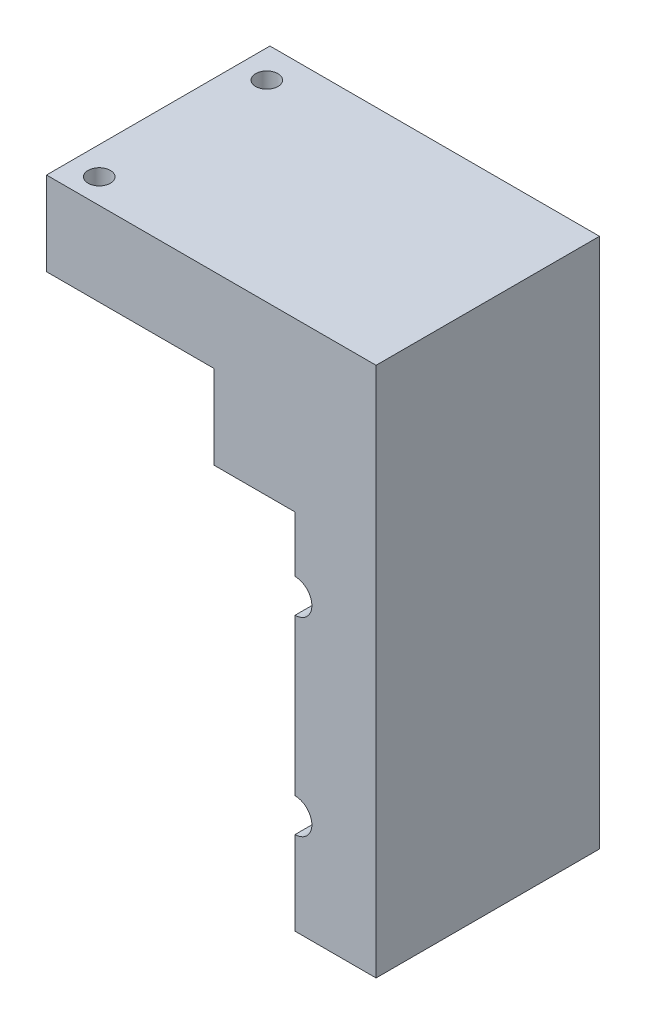
ISO-10303-21;
HEADER;
FILE_DESCRIPTION(('STEP AP214'),'2;1');
FILE_NAME('part.step','',(''),(''),'','','');
FILE_SCHEMA(('AUTOMOTIVE_DESIGN { 1 0 10303 214 1 1 1 1 }'));
ENDSEC;
DATA;
#1=APPLICATION_CONTEXT('core data for automotive mechanical design processes');
#2=APPLICATION_PROTOCOL_DEFINITION('international standard','automotive_design',2000,#1);
#3=PRODUCT_CONTEXT('',#1,'mechanical');
#4=PRODUCT('Part','Part','',(#3));
#5=PRODUCT_RELATED_PRODUCT_CATEGORY('part','',(#4));
#6=PRODUCT_DEFINITION_FORMATION('','',#4);
#7=PRODUCT_DEFINITION_CONTEXT('part definition',#1,'design');
#8=PRODUCT_DEFINITION('design','',#6,#7);
#9=PRODUCT_DEFINITION_SHAPE('','',#8);
#10=(LENGTH_UNIT() NAMED_UNIT(*) SI_UNIT(.MILLI.,.METRE.));
#11=(NAMED_UNIT(*) PLANE_ANGLE_UNIT() SI_UNIT($,.RADIAN.));
#12=(NAMED_UNIT(*) SI_UNIT($,.STERADIAN.) SOLID_ANGLE_UNIT());
#13=UNCERTAINTY_MEASURE_WITH_UNIT(LENGTH_MEASURE(1.E-05),#10,'distance_accuracy_value','');
#14=(GEOMETRIC_REPRESENTATION_CONTEXT(3) GLOBAL_UNCERTAINTY_ASSIGNED_CONTEXT((#13)) GLOBAL_UNIT_ASSIGNED_CONTEXT((#10,
#11,#12)) REPRESENTATION_CONTEXT('',''));
#15=CARTESIAN_POINT('',(0.,0.,0.));
#16=DIRECTION('',(0.,0.,1.));
#17=DIRECTION('',(1.,0.,0.));
#18=AXIS2_PLACEMENT_3D('',#15,#16,#17);
#19=CARTESIAN_POINT('',(0.,0.,40.));
#20=DIRECTION('',(1.,0.,0.));
#21=DIRECTION('',(0.,0.,-1.));
#22=AXIS2_PLACEMENT_3D('',#19,#20,#21);
#23=PLANE('',#22);
#24=DIRECTION('',(0.,-1.,0.));
#25=VECTOR('',#24,1.);
#26=CARTESIAN_POINT('',(0.,0.,0.));
#27=LINE('',#26,#25);
#28=CARTESIAN_POINT('',(0.,80.,0.));
#29=VERTEX_POINT('',#28);
#30=CARTESIAN_POINT('',(0.,65.,0.));
#31=VERTEX_POINT('',#30);
#32=EDGE_CURVE('E146',#29,#31,#27,.T.);
#33=ORIENTED_EDGE('',*,*,#32,.T.);
#34=DIRECTION('',(0.,0.,1.));
#35=VECTOR('',#34,1.);
#36=CARTESIAN_POINT('',(0.,65.,0.));
#37=LINE('',#36,#35);
#38=CARTESIAN_POINT('',(0.,65.,40.));
#39=VERTEX_POINT('',#38);
#40=EDGE_CURVE('E227',#31,#39,#37,.T.);
#41=ORIENTED_EDGE('',*,*,#40,.T.);
#42=DIRECTION('',(0.,-1.,0.));
#43=VECTOR('',#42,1.);
#44=CARTESIAN_POINT('',(0.,0.,40.));
#45=LINE('',#44,#43);
#46=CARTESIAN_POINT('',(0.,80.,40.));
#47=VERTEX_POINT('',#46);
#48=EDGE_CURVE('E156',#47,#39,#45,.T.);
#49=ORIENTED_EDGE('',*,*,#48,.F.);
#50=DIRECTION('',(0.,0.,1.));
#51=VECTOR('',#50,1.);
#52=CARTESIAN_POINT('',(0.,80.,0.));
#53=LINE('',#52,#51);
#54=EDGE_CURVE('E214',#29,#47,#53,.T.);
#55=ORIENTED_EDGE('',*,*,#54,.F.);
#56=EDGE_LOOP('',(#33,#41,#49,#55));
#57=FACE_BOUND('',#56,.T.);
#58=ADVANCED_FACE('F33',(#57),#23,.F.);
#59=CARTESIAN_POINT('',(0.,0.,40.));
#60=DIRECTION('',(0.,1.,0.));
#61=DIRECTION('',(0.,0.,1.));
#62=AXIS2_PLACEMENT_3D('',#59,#60,#61);
#63=PLANE('',#62);
#64=DIRECTION('',(1.,0.,0.));
#65=VECTOR('',#64,1.);
#66=CARTESIAN_POINT('',(0.,0.,40.));
#67=LINE('',#66,#65);
#68=CARTESIAN_POINT('',(14.5,0.,40.));
#69=VERTEX_POINT('',#68);
#70=CARTESIAN_POINT('',(29.,0.,40.));
#71=VERTEX_POINT('',#70);
#72=EDGE_CURVE('E138',#69,#71,#67,.T.);
#73=ORIENTED_EDGE('',*,*,#72,.F.);
#74=DIRECTION('',(0.,0.,1.));
#75=VECTOR('',#74,1.);
#76=CARTESIAN_POINT('',(14.5,0.,0.));
#77=LINE('',#76,#75);
#78=CARTESIAN_POINT('',(14.5,0.,0.));
#79=VERTEX_POINT('',#78);
#80=EDGE_CURVE('E122',#79,#69,#77,.T.);
#81=ORIENTED_EDGE('',*,*,#80,.F.);
#82=DIRECTION('',(1.,0.,0.));
#83=VECTOR('',#82,1.);
#84=CARTESIAN_POINT('',(0.,0.,0.));
#85=LINE('',#84,#83);
#86=CARTESIAN_POINT('',(29.,0.,0.));
#87=VERTEX_POINT('',#86);
#88=EDGE_CURVE('E136',#79,#87,#85,.T.);
#89=ORIENTED_EDGE('',*,*,#88,.T.);
#90=DIRECTION('',(0.,0.,-1.));
#91=VECTOR('',#90,1.);
#92=CARTESIAN_POINT('',(29.,0.,40.));
#93=LINE('',#92,#91);
#94=EDGE_CURVE('E160',#71,#87,#93,.T.);
#95=ORIENTED_EDGE('',*,*,#94,.F.);
#96=EDGE_LOOP('',(#73,#81,#89,#95));
#97=FACE_BOUND('',#96,.T.);
#98=ADVANCED_FACE('F134',(#97),#63,.F.);
#99=CARTESIAN_POINT('',(29.,0.,40.));
#100=DIRECTION('',(-1.,0.,0.));
#101=DIRECTION('',(0.,0.,1.));
#102=AXIS2_PLACEMENT_3D('',#99,#100,#101);
#103=PLANE('',#102);
#104=DIRECTION('',(0.,1.,0.));
#105=VECTOR('',#104,1.);
#106=CARTESIAN_POINT('',(29.,0.,0.));
#107=LINE('',#106,#105);
#108=CARTESIAN_POINT('',(29.,95.,0.));
#109=VERTEX_POINT('',#108);
#110=EDGE_CURVE('E145',#87,#109,#107,.T.);
#111=ORIENTED_EDGE('',*,*,#110,.T.);
#112=DIRECTION('',(0.,0.,-1.));
#113=VECTOR('',#112,1.);
#114=CARTESIAN_POINT('',(29.,95.,40.));
#115=LINE('',#114,#113);
#116=CARTESIAN_POINT('',(29.,95.,40.));
#117=VERTEX_POINT('',#116);
#118=EDGE_CURVE('E157',#117,#109,#115,.T.);
#119=ORIENTED_EDGE('',*,*,#118,.F.);
#120=DIRECTION('',(0.,1.,0.));
#121=VECTOR('',#120,1.);
#122=CARTESIAN_POINT('',(29.,0.,40.));
#123=LINE('',#122,#121);
#124=EDGE_CURVE('E189',#71,#117,#123,.T.);
#125=ORIENTED_EDGE('',*,*,#124,.F.);
#126=ORIENTED_EDGE('',*,*,#94,.T.);
#127=EDGE_LOOP('',(#111,#119,#125,#126));
#128=FACE_BOUND('',#127,.T.);
#129=ADVANCED_FACE('F303',(#128),#103,.F.);
#130=CARTESIAN_POINT('',(0.,95.,40.));
#131=DIRECTION('',(0.,-1.,0.));
#132=DIRECTION('',(0.,0.,-1.));
#133=AXIS2_PLACEMENT_3D('',#130,#131,#132);
#134=PLANE('',#133);
#135=CARTESIAN_POINT('',(-25.,95.,35.5635338818416));
#136=DIRECTION('',(0.,1.,0.));
#137=DIRECTION('',(0.,0.,1.));
#138=AXIS2_PLACEMENT_3D('',#135,#136,#137);
#139=CIRCLE('',#138,2.00000000000001);
#140=CARTESIAN_POINT('',(-25.,95.,37.5635338818416));
#141=VERTEX_POINT('',#140);
#142=EDGE_CURVE('E286',#141,#141,#139,.T.);
#143=ORIENTED_EDGE('',*,*,#142,.F.);
#144=EDGE_LOOP('',(#143));
#145=FACE_BOUND('',#144,.T.);
#146=CARTESIAN_POINT('',(-25.,95.,5.56353388184163));
#147=DIRECTION('',(0.,1.,0.));
#148=DIRECTION('',(0.,0.,1.));
#149=AXIS2_PLACEMENT_3D('',#146,#147,#148);
#150=CIRCLE('',#149,2.);
#151=CARTESIAN_POINT('',(-25.,95.,7.56353388184164));
#152=VERTEX_POINT('',#151);
#153=EDGE_CURVE('E280',#152,#152,#150,.T.);
#154=ORIENTED_EDGE('',*,*,#153,.F.);
#155=EDGE_LOOP('',(#154));
#156=FACE_BOUND('',#155,.T.);
#157=DIRECTION('',(-1.,0.,0.));
#158=VECTOR('',#157,1.);
#159=CARTESIAN_POINT('',(0.,95.,0.));
#160=LINE('',#159,#158);
#161=CARTESIAN_POINT('',(-30.,95.,0.));
#162=VERTEX_POINT('',#161);
#163=EDGE_CURVE('E148',#109,#162,#160,.T.);
#164=ORIENTED_EDGE('',*,*,#163,.T.);
#165=DIRECTION('',(0.,0.,-1.));
#166=VECTOR('',#165,1.);
#167=CARTESIAN_POINT('',(-30.,95.,0.));
#168=LINE('',#167,#166);
#169=CARTESIAN_POINT('',(-30.,95.,40.));
#170=VERTEX_POINT('',#169);
#171=EDGE_CURVE('E203',#170,#162,#168,.T.);
#172=ORIENTED_EDGE('',*,*,#171,.F.);
#173=DIRECTION('',(-1.,0.,0.));
#174=VECTOR('',#173,1.);
#175=CARTESIAN_POINT('',(0.,95.,40.));
#176=LINE('',#175,#174);
#177=EDGE_CURVE('E161',#117,#170,#176,.T.);
#178=ORIENTED_EDGE('',*,*,#177,.F.);
#179=ORIENTED_EDGE('',*,*,#118,.T.);
#180=EDGE_LOOP('',(#164,#172,#178,#179));
#181=FACE_BOUND('',#180,.T.);
#182=ADVANCED_FACE('F208',(#145,#156,#181),#134,.F.);
#183=CARTESIAN_POINT('',(0.,0.,40.));
#184=DIRECTION('',(0.,0.,-1.));
#185=DIRECTION('',(-1.,0.,0.));
#186=AXIS2_PLACEMENT_3D('',#183,#184,#185);
#187=PLANE('',#186);
#188=ORIENTED_EDGE('',*,*,#48,.T.);
#189=DIRECTION('',(-1.,0.,0.));
#190=VECTOR('',#189,1.);
#191=CARTESIAN_POINT('',(0.,65.,40.));
#192=LINE('',#191,#190);
#193=CARTESIAN_POINT('',(14.5,65.,40.));
#194=VERTEX_POINT('',#193);
#195=EDGE_CURVE('E228',#194,#39,#192,.T.);
#196=ORIENTED_EDGE('',*,*,#195,.F.);
#197=DIRECTION('',(0.,1.,0.));
#198=VECTOR('',#197,1.);
#199=CARTESIAN_POINT('',(14.5,65.,40.));
#200=LINE('',#199,#198);
#201=CARTESIAN_POINT('',(14.5,55.005,40.));
#202=VERTEX_POINT('',#201);
#203=EDGE_CURVE('E177',#202,#194,#200,.T.);
#204=ORIENTED_EDGE('',*,*,#203,.F.);
#205=CARTESIAN_POINT('',(14.5,52.,40.));
#206=DIRECTION('',(0.,0.,1.));
#207=DIRECTION('',(1.,0.,0.));
#208=AXIS2_PLACEMENT_3D('',#205,#206,#207);
#209=CIRCLE('',#208,3.00499999999999);
#210=CARTESIAN_POINT('',(14.5,48.995,40.));
#211=VERTEX_POINT('',#210);
#212=EDGE_CURVE('E167',#211,#202,#209,.T.);
#213=ORIENTED_EDGE('',*,*,#212,.F.);
#214=CARTESIAN_POINT('',(14.5,21.005,40.));
#215=VERTEX_POINT('',#214);
#216=EDGE_CURVE('E55',#215,#211,#200,.T.);
#217=ORIENTED_EDGE('',*,*,#216,.F.);
#218=CARTESIAN_POINT('',(14.5,18.,40.));
#219=DIRECTION('',(0.,0.,1.));
#220=DIRECTION('',(1.,0.,0.));
#221=AXIS2_PLACEMENT_3D('',#218,#219,#220);
#222=CIRCLE('',#221,3.00499999999999);
#223=CARTESIAN_POINT('',(14.5,14.995,40.));
#224=VERTEX_POINT('',#223);
#225=EDGE_CURVE('E178',#224,#215,#222,.T.);
#226=ORIENTED_EDGE('',*,*,#225,.F.);
#227=EDGE_CURVE('E47',#69,#224,#200,.T.);
#228=ORIENTED_EDGE('',*,*,#227,.F.);
#229=ORIENTED_EDGE('',*,*,#72,.T.);
#230=ORIENTED_EDGE('',*,*,#124,.T.);
#231=ORIENTED_EDGE('',*,*,#177,.T.);
#232=DIRECTION('',(0.,1.,0.));
#233=VECTOR('',#232,1.);
#234=CARTESIAN_POINT('',(-30.,95.,40.));
#235=LINE('',#234,#233);
#236=CARTESIAN_POINT('',(-30.,80.,40.));
#237=VERTEX_POINT('',#236);
#238=EDGE_CURVE('E194',#237,#170,#235,.T.);
#239=ORIENTED_EDGE('',*,*,#238,.F.);
#240=DIRECTION('',(1.,0.,0.));
#241=VECTOR('',#240,1.);
#242=CARTESIAN_POINT('',(-30.,80.,40.));
#243=LINE('',#242,#241);
#244=EDGE_CURVE('E209',#237,#47,#243,.T.);
#245=ORIENTED_EDGE('',*,*,#244,.T.);
#246=EDGE_LOOP('',(#188,#196,#204,#213,#217,#226,#228,#229,#230,#231,#239,#245));
#247=FACE_BOUND('',#246,.T.);
#248=ADVANCED_FACE('F173',(#247),#187,.F.);
#249=CARTESIAN_POINT('',(0.,0.,0.));
#250=DIRECTION('',(0.,0.,-1.));
#251=DIRECTION('',(-1.,0.,0.));
#252=AXIS2_PLACEMENT_3D('',#249,#250,#251);
#253=PLANE('',#252);
#254=DIRECTION('',(-1.,0.,0.));
#255=VECTOR('',#254,1.);
#256=CARTESIAN_POINT('',(0.,65.,0.));
#257=LINE('',#256,#255);
#258=CARTESIAN_POINT('',(14.5,65.,0.));
#259=VERTEX_POINT('',#258);
#260=EDGE_CURVE('E128',#259,#31,#257,.T.);
#261=ORIENTED_EDGE('',*,*,#260,.T.);
#262=ORIENTED_EDGE('',*,*,#32,.F.);
#263=DIRECTION('',(1.,0.,0.));
#264=VECTOR('',#263,1.);
#265=CARTESIAN_POINT('',(-30.,80.,0.));
#266=LINE('',#265,#264);
#267=CARTESIAN_POINT('',(-30.,80.,0.));
#268=VERTEX_POINT('',#267);
#269=EDGE_CURVE('E186',#268,#29,#266,.T.);
#270=ORIENTED_EDGE('',*,*,#269,.F.);
#271=DIRECTION('',(0.,-1.,0.));
#272=VECTOR('',#271,1.);
#273=CARTESIAN_POINT('',(-30.,95.,0.));
#274=LINE('',#273,#272);
#275=EDGE_CURVE('E216',#162,#268,#274,.T.);
#276=ORIENTED_EDGE('',*,*,#275,.F.);
#277=ORIENTED_EDGE('',*,*,#163,.F.);
#278=ORIENTED_EDGE('',*,*,#110,.F.);
#279=ORIENTED_EDGE('',*,*,#88,.F.);
#280=DIRECTION('',(0.,1.,0.));
#281=VECTOR('',#280,1.);
#282=CARTESIAN_POINT('',(14.5,65.,0.));
#283=LINE('',#282,#281);
#284=CARTESIAN_POINT('',(14.5,14.995,0.));
#285=VERTEX_POINT('',#284);
#286=EDGE_CURVE('E119',#79,#285,#283,.T.);
#287=ORIENTED_EDGE('',*,*,#286,.T.);
#288=CARTESIAN_POINT('',(14.5,18.,0.));
#289=DIRECTION('',(0.,0.,1.));
#290=DIRECTION('',(1.,0.,0.));
#291=AXIS2_PLACEMENT_3D('',#288,#289,#290);
#292=CIRCLE('',#291,3.00499999999999);
#293=CARTESIAN_POINT('',(14.5,21.005,0.));
#294=VERTEX_POINT('',#293);
#295=EDGE_CURVE('E181',#285,#294,#292,.T.);
#296=ORIENTED_EDGE('',*,*,#295,.T.);
#297=CARTESIAN_POINT('',(14.5,48.995,0.));
#298=VERTEX_POINT('',#297);
#299=EDGE_CURVE('E129',#294,#298,#283,.T.);
#300=ORIENTED_EDGE('',*,*,#299,.T.);
#301=CARTESIAN_POINT('',(14.5,52.,0.));
#302=DIRECTION('',(0.,0.,1.));
#303=DIRECTION('',(1.,0.,0.));
#304=AXIS2_PLACEMENT_3D('',#301,#302,#303);
#305=CIRCLE('',#304,3.00499999999999);
#306=CARTESIAN_POINT('',(14.5,55.005,0.));
#307=VERTEX_POINT('',#306);
#308=EDGE_CURVE('E151',#298,#307,#305,.T.);
#309=ORIENTED_EDGE('',*,*,#308,.T.);
#310=EDGE_CURVE('E131',#307,#259,#283,.T.);
#311=ORIENTED_EDGE('',*,*,#310,.T.);
#312=EDGE_LOOP('',(#261,#262,#270,#276,#277,#278,#279,#287,#296,#300,#309,#311));
#313=FACE_BOUND('',#312,.T.);
#314=ADVANCED_FACE('F143',(#313),#253,.T.);
#315=CARTESIAN_POINT('',(14.5,18.,0.));
#316=DIRECTION('',(0.,0.,1.));
#317=DIRECTION('',(1.,0.,0.));
#318=AXIS2_PLACEMENT_3D('',#315,#316,#317);
#319=CYLINDRICAL_SURFACE('',#318,3.00499999999999);
#320=ORIENTED_EDGE('',*,*,#225,.T.);
#321=DIRECTION('',(0.,0.,1.));
#322=VECTOR('',#321,1.);
#323=CARTESIAN_POINT('',(14.5,21.005,0.));
#324=LINE('',#323,#322);
#325=EDGE_CURVE('E217',#215,#294,#324,.F.);
#326=ORIENTED_EDGE('',*,*,#325,.T.);
#327=ORIENTED_EDGE('',*,*,#295,.F.);
#328=DIRECTION('',(0.,0.,1.));
#329=VECTOR('',#328,1.);
#330=CARTESIAN_POINT('',(14.5,14.995,0.));
#331=LINE('',#330,#329);
#332=EDGE_CURVE('E123',#285,#224,#331,.T.);
#333=ORIENTED_EDGE('',*,*,#332,.T.);
#334=EDGE_LOOP('',(#320,#326,#327,#333));
#335=FACE_BOUND('',#334,.T.);
#336=ADVANCED_FACE('F241',(#335),#319,.F.);
#337=CARTESIAN_POINT('',(14.5,52.,0.));
#338=DIRECTION('',(0.,0.,1.));
#339=DIRECTION('',(1.,0.,0.));
#340=AXIS2_PLACEMENT_3D('',#337,#338,#339);
#341=CYLINDRICAL_SURFACE('',#340,3.00499999999999);
#342=ORIENTED_EDGE('',*,*,#212,.T.);
#343=DIRECTION('',(0.,0.,1.));
#344=VECTOR('',#343,1.);
#345=CARTESIAN_POINT('',(14.5,55.005,0.));
#346=LINE('',#345,#344);
#347=EDGE_CURVE('E11',#202,#307,#346,.F.);
#348=ORIENTED_EDGE('',*,*,#347,.T.);
#349=ORIENTED_EDGE('',*,*,#308,.F.);
#350=DIRECTION('',(0.,0.,1.));
#351=VECTOR('',#350,1.);
#352=CARTESIAN_POINT('',(14.5,48.995,0.));
#353=LINE('',#352,#351);
#354=EDGE_CURVE('E40',#298,#211,#353,.T.);
#355=ORIENTED_EDGE('',*,*,#354,.T.);
#356=EDGE_LOOP('',(#342,#348,#349,#355));
#357=FACE_BOUND('',#356,.T.);
#358=ADVANCED_FACE('F166',(#357),#341,.F.);
#359=CARTESIAN_POINT('',(-30.,80.,0.));
#360=DIRECTION('',(0.,1.,0.));
#361=DIRECTION('',(0.,0.,1.));
#362=AXIS2_PLACEMENT_3D('',#359,#360,#361);
#363=PLANE('',#362);
#364=ORIENTED_EDGE('',*,*,#54,.T.);
#365=ORIENTED_EDGE('',*,*,#244,.F.);
#366=DIRECTION('',(0.,0.,1.));
#367=VECTOR('',#366,1.);
#368=CARTESIAN_POINT('',(-30.,80.,0.));
#369=LINE('',#368,#367);
#370=EDGE_CURVE('E205',#268,#237,#369,.T.);
#371=ORIENTED_EDGE('',*,*,#370,.F.);
#372=ORIENTED_EDGE('',*,*,#269,.T.);
#373=EDGE_LOOP('',(#364,#365,#371,#372));
#374=FACE_BOUND('',#373,.T.);
#375=ADVANCED_FACE('F221',(#374),#363,.F.);
#376=CARTESIAN_POINT('',(-30.,0.,0.));
#377=DIRECTION('',(-1.,0.,0.));
#378=DIRECTION('',(0.,0.,1.));
#379=AXIS2_PLACEMENT_3D('',#376,#377,#378);
#380=PLANE('',#379);
#381=ORIENTED_EDGE('',*,*,#275,.T.);
#382=ORIENTED_EDGE('',*,*,#370,.T.);
#383=ORIENTED_EDGE('',*,*,#238,.T.);
#384=ORIENTED_EDGE('',*,*,#171,.T.);
#385=EDGE_LOOP('',(#381,#382,#383,#384));
#386=FACE_BOUND('',#385,.T.);
#387=ADVANCED_FACE('F202',(#386),#380,.T.);
#388=CARTESIAN_POINT('',(14.5,65.,0.));
#389=DIRECTION('',(1.,0.,0.));
#390=DIRECTION('',(0.,1.,0.));
#391=AXIS2_PLACEMENT_3D('',#388,#389,#390);
#392=PLANE('',#391);
#393=CARTESIAN_POINT('',(14.5,35.,5.));
#394=DIRECTION('',(-1.,0.,0.));
#395=DIRECTION('',(0.,-1.,0.));
#396=AXIS2_PLACEMENT_3D('',#393,#394,#395);
#397=CIRCLE('',#396,2.);
#398=CARTESIAN_POINT('',(14.5,33.,5.));
#399=VERTEX_POINT('',#398);
#400=EDGE_CURVE('E275',#399,#399,#397,.T.);
#401=ORIENTED_EDGE('',*,*,#400,.F.);
#402=EDGE_LOOP('',(#401));
#403=FACE_BOUND('',#402,.T.);
#404=CARTESIAN_POINT('',(14.5,35.,35.));
#405=DIRECTION('',(-1.,0.,0.));
#406=DIRECTION('',(0.,-1.,0.));
#407=AXIS2_PLACEMENT_3D('',#404,#405,#406);
#408=CIRCLE('',#407,2.);
#409=CARTESIAN_POINT('',(14.5,33.,35.));
#410=VERTEX_POINT('',#409);
#411=EDGE_CURVE('E268',#410,#410,#408,.T.);
#412=ORIENTED_EDGE('',*,*,#411,.F.);
#413=EDGE_LOOP('',(#412));
#414=FACE_BOUND('',#413,.T.);
#415=ORIENTED_EDGE('',*,*,#216,.T.);
#416=ORIENTED_EDGE('',*,*,#354,.F.);
#417=ORIENTED_EDGE('',*,*,#299,.F.);
#418=ORIENTED_EDGE('',*,*,#325,.F.);
#419=EDGE_LOOP('',(#415,#416,#417,#418));
#420=FACE_BOUND('',#419,.T.);
#421=ADVANCED_FACE('F344',(#403,#414,#420),#392,.F.);
#422=CARTESIAN_POINT('',(14.5,60.0025,5.));
#423=DIRECTION('',(-1.,0.,0.));
#424=DIRECTION('',(0.,-1.,0.));
#425=AXIS2_PLACEMENT_3D('',#422,#423,#424);
#426=CIRCLE('',#425,2.);
#427=CARTESIAN_POINT('',(14.5,58.0025,5.));
#428=VERTEX_POINT('',#427);
#429=EDGE_CURVE('E250',#428,#428,#426,.T.);
#430=ORIENTED_EDGE('',*,*,#429,.F.);
#431=EDGE_LOOP('',(#430));
#432=FACE_BOUND('',#431,.T.);
#433=CARTESIAN_POINT('',(14.5,60.0025,35.));
#434=DIRECTION('',(-1.,0.,0.));
#435=DIRECTION('',(0.,-1.,0.));
#436=AXIS2_PLACEMENT_3D('',#433,#434,#435);
#437=CIRCLE('',#436,2.);
#438=CARTESIAN_POINT('',(14.5,58.0025,35.));
#439=VERTEX_POINT('',#438);
#440=EDGE_CURVE('E243',#439,#439,#437,.T.);
#441=ORIENTED_EDGE('',*,*,#440,.F.);
#442=EDGE_LOOP('',(#441));
#443=FACE_BOUND('',#442,.T.);
#444=ORIENTED_EDGE('',*,*,#203,.T.);
#445=DIRECTION('',(0.,0.,1.));
#446=VECTOR('',#445,1.);
#447=CARTESIAN_POINT('',(14.5,65.,0.));
#448=LINE('',#447,#446);
#449=EDGE_CURVE('E139',#259,#194,#448,.T.);
#450=ORIENTED_EDGE('',*,*,#449,.F.);
#451=ORIENTED_EDGE('',*,*,#310,.F.);
#452=ORIENTED_EDGE('',*,*,#347,.F.);
#453=EDGE_LOOP('',(#444,#450,#451,#452));
#454=FACE_BOUND('',#453,.T.);
#455=ADVANCED_FACE('F347',(#432,#443,#454),#392,.F.);
#456=CARTESIAN_POINT('',(0.,65.,0.));
#457=DIRECTION('',(0.,1.,0.));
#458=DIRECTION('',(0.,0.,1.));
#459=AXIS2_PLACEMENT_3D('',#456,#457,#458);
#460=PLANE('',#459);
#461=ORIENTED_EDGE('',*,*,#195,.T.);
#462=ORIENTED_EDGE('',*,*,#40,.F.);
#463=ORIENTED_EDGE('',*,*,#260,.F.);
#464=ORIENTED_EDGE('',*,*,#449,.T.);
#465=EDGE_LOOP('',(#461,#462,#463,#464));
#466=FACE_BOUND('',#465,.T.);
#467=ADVANCED_FACE('F349',(#466),#460,.F.);
#468=CARTESIAN_POINT('',(14.5,7.4975,5.));
#469=DIRECTION('',(-1.,0.,0.));
#470=DIRECTION('',(0.,-1.,0.));
#471=AXIS2_PLACEMENT_3D('',#468,#469,#470);
#472=CIRCLE('',#471,2.);
#473=CARTESIAN_POINT('',(14.5,5.4975,5.));
#474=VERTEX_POINT('',#473);
#475=EDGE_CURVE('E263',#474,#474,#472,.T.);
#476=ORIENTED_EDGE('',*,*,#475,.F.);
#477=EDGE_LOOP('',(#476));
#478=FACE_BOUND('',#477,.T.);
#479=CARTESIAN_POINT('',(14.5,7.4975,35.));
#480=DIRECTION('',(-1.,0.,0.));
#481=DIRECTION('',(0.,-1.,0.));
#482=AXIS2_PLACEMENT_3D('',#479,#480,#481);
#483=CIRCLE('',#482,2.);
#484=CARTESIAN_POINT('',(14.5,5.4975,35.));
#485=VERTEX_POINT('',#484);
#486=EDGE_CURVE('E256',#485,#485,#483,.T.);
#487=ORIENTED_EDGE('',*,*,#486,.F.);
#488=EDGE_LOOP('',(#487));
#489=FACE_BOUND('',#488,.T.);
#490=ORIENTED_EDGE('',*,*,#286,.F.);
#491=ORIENTED_EDGE('',*,*,#80,.T.);
#492=ORIENTED_EDGE('',*,*,#227,.T.);
#493=ORIENTED_EDGE('',*,*,#332,.F.);
#494=EDGE_LOOP('',(#490,#491,#492,#493));
#495=FACE_BOUND('',#494,.T.);
#496=ADVANCED_FACE('F121',(#478,#489,#495),#392,.F.);
#497=CARTESIAN_POINT('',(19.5,60.0025,35.));
#498=DIRECTION('',(-1.,0.,0.));
#499=DIRECTION('',(0.,-1.,0.));
#500=AXIS2_PLACEMENT_3D('',#497,#498,#499);
#501=CYLINDRICAL_SURFACE('',#500,2.);
#502=CARTESIAN_POINT('',(19.5,60.0025,35.));
#503=DIRECTION('',(-1.,0.,0.));
#504=DIRECTION('',(0.,-1.,0.));
#505=AXIS2_PLACEMENT_3D('',#502,#503,#504);
#506=CIRCLE('',#505,2.);
#507=CARTESIAN_POINT('',(19.5,58.0025,35.));
#508=VERTEX_POINT('',#507);
#509=EDGE_CURVE('E246',#508,#508,#506,.T.);
#510=ORIENTED_EDGE('',*,*,#509,.F.);
#511=EDGE_LOOP('',(#510));
#512=FACE_BOUND('',#511,.T.);
#513=ORIENTED_EDGE('',*,*,#440,.T.);
#514=EDGE_LOOP('',(#513));
#515=FACE_BOUND('',#514,.T.);
#516=ADVANCED_FACE('F352',(#512,#515),#501,.F.);
#517=CARTESIAN_POINT('',(19.5,60.0025,35.));
#518=DIRECTION('',(-1.,0.,0.));
#519=DIRECTION('',(0.,-1.,0.));
#520=AXIS2_PLACEMENT_3D('',#517,#518,#519);
#521=PLANE('',#520);
#522=ORIENTED_EDGE('',*,*,#509,.T.);
#523=EDGE_LOOP('',(#522));
#524=FACE_BOUND('',#523,.T.);
#525=ADVANCED_FACE('F355',(#524),#521,.T.);
#526=CARTESIAN_POINT('',(19.5,60.0025,5.));
#527=DIRECTION('',(-1.,0.,0.));
#528=DIRECTION('',(0.,-1.,0.));
#529=AXIS2_PLACEMENT_3D('',#526,#527,#528);
#530=CYLINDRICAL_SURFACE('',#529,2.);
#531=CARTESIAN_POINT('',(19.5,60.0025,5.));
#532=DIRECTION('',(-1.,0.,0.));
#533=DIRECTION('',(0.,-1.,0.));
#534=AXIS2_PLACEMENT_3D('',#531,#532,#533);
#535=CIRCLE('',#534,2.);
#536=CARTESIAN_POINT('',(19.5,58.0025,5.));
#537=VERTEX_POINT('',#536);
#538=EDGE_CURVE('E253',#537,#537,#535,.T.);
#539=ORIENTED_EDGE('',*,*,#538,.F.);
#540=EDGE_LOOP('',(#539));
#541=FACE_BOUND('',#540,.T.);
#542=ORIENTED_EDGE('',*,*,#429,.T.);
#543=EDGE_LOOP('',(#542));
#544=FACE_BOUND('',#543,.T.);
#545=ADVANCED_FACE('F359',(#541,#544),#530,.F.);
#546=CARTESIAN_POINT('',(19.5,60.0025,5.));
#547=DIRECTION('',(-1.,0.,0.));
#548=DIRECTION('',(0.,-1.,0.));
#549=AXIS2_PLACEMENT_3D('',#546,#547,#548);
#550=PLANE('',#549);
#551=ORIENTED_EDGE('',*,*,#538,.T.);
#552=EDGE_LOOP('',(#551));
#553=FACE_BOUND('',#552,.T.);
#554=ADVANCED_FACE('F363',(#553),#550,.T.);
#555=CARTESIAN_POINT('',(19.5,7.4975,35.));
#556=DIRECTION('',(-1.,0.,0.));
#557=DIRECTION('',(0.,-1.,0.));
#558=AXIS2_PLACEMENT_3D('',#555,#556,#557);
#559=CYLINDRICAL_SURFACE('',#558,2.);
#560=CARTESIAN_POINT('',(19.5,7.4975,35.));
#561=DIRECTION('',(-1.,0.,0.));
#562=DIRECTION('',(0.,-1.,0.));
#563=AXIS2_PLACEMENT_3D('',#560,#561,#562);
#564=CIRCLE('',#563,2.);
#565=CARTESIAN_POINT('',(19.5,5.4975,35.));
#566=VERTEX_POINT('',#565);
#567=EDGE_CURVE('E259',#566,#566,#564,.T.);
#568=ORIENTED_EDGE('',*,*,#567,.F.);
#569=EDGE_LOOP('',(#568));
#570=FACE_BOUND('',#569,.T.);
#571=ORIENTED_EDGE('',*,*,#486,.T.);
#572=EDGE_LOOP('',(#571));
#573=FACE_BOUND('',#572,.T.);
#574=ADVANCED_FACE('F367',(#570,#573),#559,.F.);
#575=CARTESIAN_POINT('',(19.5,7.4975,35.));
#576=DIRECTION('',(-1.,0.,0.));
#577=DIRECTION('',(0.,-1.,0.));
#578=AXIS2_PLACEMENT_3D('',#575,#576,#577);
#579=PLANE('',#578);
#580=ORIENTED_EDGE('',*,*,#567,.T.);
#581=EDGE_LOOP('',(#580));
#582=FACE_BOUND('',#581,.T.);
#583=ADVANCED_FACE('F371',(#582),#579,.T.);
#584=CARTESIAN_POINT('',(19.5,7.4975,5.));
#585=DIRECTION('',(-1.,0.,0.));
#586=DIRECTION('',(0.,-1.,0.));
#587=AXIS2_PLACEMENT_3D('',#584,#585,#586);
#588=CYLINDRICAL_SURFACE('',#587,2.);
#589=CARTESIAN_POINT('',(19.5,7.4975,5.));
#590=DIRECTION('',(-1.,0.,0.));
#591=DIRECTION('',(0.,-1.,0.));
#592=AXIS2_PLACEMENT_3D('',#589,#590,#591);
#593=CIRCLE('',#592,2.);
#594=CARTESIAN_POINT('',(19.5,5.4975,5.));
#595=VERTEX_POINT('',#594);
#596=EDGE_CURVE('E247',#595,#595,#593,.T.);
#597=ORIENTED_EDGE('',*,*,#596,.F.);
#598=EDGE_LOOP('',(#597));
#599=FACE_BOUND('',#598,.T.);
#600=ORIENTED_EDGE('',*,*,#475,.T.);
#601=EDGE_LOOP('',(#600));
#602=FACE_BOUND('',#601,.T.);
#603=ADVANCED_FACE('F375',(#599,#602),#588,.F.);
#604=CARTESIAN_POINT('',(19.5,7.4975,5.));
#605=DIRECTION('',(-1.,0.,0.));
#606=DIRECTION('',(0.,-1.,0.));
#607=AXIS2_PLACEMENT_3D('',#604,#605,#606);
#608=PLANE('',#607);
#609=ORIENTED_EDGE('',*,*,#596,.T.);
#610=EDGE_LOOP('',(#609));
#611=FACE_BOUND('',#610,.T.);
#612=ADVANCED_FACE('F379',(#611),#608,.T.);
#613=CARTESIAN_POINT('',(19.5,35.,35.));
#614=DIRECTION('',(-1.,0.,0.));
#615=DIRECTION('',(0.,-1.,0.));
#616=AXIS2_PLACEMENT_3D('',#613,#614,#615);
#617=CYLINDRICAL_SURFACE('',#616,2.);
#618=CARTESIAN_POINT('',(19.5,35.,35.));
#619=DIRECTION('',(-1.,0.,0.));
#620=DIRECTION('',(0.,-1.,0.));
#621=AXIS2_PLACEMENT_3D('',#618,#619,#620);
#622=CIRCLE('',#621,2.);
#623=CARTESIAN_POINT('',(19.5,33.,35.));
#624=VERTEX_POINT('',#623);
#625=EDGE_CURVE('E271',#624,#624,#622,.T.);
#626=ORIENTED_EDGE('',*,*,#625,.F.);
#627=EDGE_LOOP('',(#626));
#628=FACE_BOUND('',#627,.T.);
#629=ORIENTED_EDGE('',*,*,#411,.T.);
#630=EDGE_LOOP('',(#629));
#631=FACE_BOUND('',#630,.T.);
#632=ADVANCED_FACE('F383',(#628,#631),#617,.F.);
#633=CARTESIAN_POINT('',(19.5,35.,35.));
#634=DIRECTION('',(-1.,0.,0.));
#635=DIRECTION('',(0.,-1.,0.));
#636=AXIS2_PLACEMENT_3D('',#633,#634,#635);
#637=PLANE('',#636);
#638=ORIENTED_EDGE('',*,*,#625,.T.);
#639=EDGE_LOOP('',(#638));
#640=FACE_BOUND('',#639,.T.);
#641=ADVANCED_FACE('F387',(#640),#637,.T.);
#642=CARTESIAN_POINT('',(19.5,35.,5.));
#643=DIRECTION('',(-1.,0.,0.));
#644=DIRECTION('',(0.,-1.,0.));
#645=AXIS2_PLACEMENT_3D('',#642,#643,#644);
#646=CYLINDRICAL_SURFACE('',#645,2.);
#647=CARTESIAN_POINT('',(19.5,35.,5.));
#648=DIRECTION('',(-1.,0.,0.));
#649=DIRECTION('',(0.,-1.,0.));
#650=AXIS2_PLACEMENT_3D('',#647,#648,#649);
#651=CIRCLE('',#650,2.);
#652=CARTESIAN_POINT('',(19.5,33.,5.));
#653=VERTEX_POINT('',#652);
#654=EDGE_CURVE('E260',#653,#653,#651,.T.);
#655=ORIENTED_EDGE('',*,*,#654,.F.);
#656=EDGE_LOOP('',(#655));
#657=FACE_BOUND('',#656,.T.);
#658=ORIENTED_EDGE('',*,*,#400,.T.);
#659=EDGE_LOOP('',(#658));
#660=FACE_BOUND('',#659,.T.);
#661=ADVANCED_FACE('F318',(#657,#660),#646,.F.);
#662=CARTESIAN_POINT('',(19.5,35.,5.));
#663=DIRECTION('',(-1.,0.,0.));
#664=DIRECTION('',(0.,-1.,0.));
#665=AXIS2_PLACEMENT_3D('',#662,#663,#664);
#666=PLANE('',#665);
#667=ORIENTED_EDGE('',*,*,#654,.T.);
#668=EDGE_LOOP('',(#667));
#669=FACE_BOUND('',#668,.T.);
#670=ADVANCED_FACE('F309',(#669),#666,.T.);
#671=CARTESIAN_POINT('',(-25.,90.,5.56353388184163));
#672=DIRECTION('',(0.,1.,0.));
#673=DIRECTION('',(0.,0.,1.));
#674=AXIS2_PLACEMENT_3D('',#671,#672,#673);
#675=CYLINDRICAL_SURFACE('',#674,2.);
#676=CARTESIAN_POINT('',(-25.,90.,5.56353388184163));
#677=DIRECTION('',(0.,1.,0.));
#678=DIRECTION('',(0.,0.,1.));
#679=AXIS2_PLACEMENT_3D('',#676,#677,#678);
#680=CIRCLE('',#679,2.);
#681=CARTESIAN_POINT('',(-25.,90.,7.56353388184164));
#682=VERTEX_POINT('',#681);
#683=EDGE_CURVE('E283',#682,#682,#680,.T.);
#684=ORIENTED_EDGE('',*,*,#683,.F.);
#685=EDGE_LOOP('',(#684));
#686=FACE_BOUND('',#685,.T.);
#687=ORIENTED_EDGE('',*,*,#153,.T.);
#688=EDGE_LOOP('',(#687));
#689=FACE_BOUND('',#688,.T.);
#690=ADVANCED_FACE('F307',(#686,#689),#675,.F.);
#691=CARTESIAN_POINT('',(-25.,90.,5.56353388184163));
#692=DIRECTION('',(0.,1.,0.));
#693=DIRECTION('',(0.,0.,1.));
#694=AXIS2_PLACEMENT_3D('',#691,#692,#693);
#695=PLANE('',#694);
#696=ORIENTED_EDGE('',*,*,#683,.T.);
#697=EDGE_LOOP('',(#696));
#698=FACE_BOUND('',#697,.T.);
#699=ADVANCED_FACE('F297',(#698),#695,.T.);
#700=CARTESIAN_POINT('',(-25.,90.,35.5635338818416));
#701=DIRECTION('',(0.,1.,0.));
#702=DIRECTION('',(0.,0.,1.));
#703=AXIS2_PLACEMENT_3D('',#700,#701,#702);
#704=CYLINDRICAL_SURFACE('',#703,2.00000000000001);
#705=CARTESIAN_POINT('',(-25.,90.,35.5635338818416));
#706=DIRECTION('',(0.,1.,0.));
#707=DIRECTION('',(0.,0.,1.));
#708=AXIS2_PLACEMENT_3D('',#705,#706,#707);
#709=CIRCLE('',#708,2.00000000000001);
#710=CARTESIAN_POINT('',(-25.,90.,37.5635338818416));
#711=VERTEX_POINT('',#710);
#712=EDGE_CURVE('E272',#711,#711,#709,.T.);
#713=ORIENTED_EDGE('',*,*,#712,.F.);
#714=EDGE_LOOP('',(#713));
#715=FACE_BOUND('',#714,.T.);
#716=ORIENTED_EDGE('',*,*,#142,.T.);
#717=EDGE_LOOP('',(#716));
#718=FACE_BOUND('',#717,.T.);
#719=ADVANCED_FACE('F294',(#715,#718),#704,.F.);
#720=CARTESIAN_POINT('',(-25.,90.,35.5635338818416));
#721=DIRECTION('',(0.,1.,0.));
#722=DIRECTION('',(0.,0.,1.));
#723=AXIS2_PLACEMENT_3D('',#720,#721,#722);
#724=PLANE('',#723);
#725=ORIENTED_EDGE('',*,*,#712,.T.);
#726=EDGE_LOOP('',(#725));
#727=FACE_BOUND('',#726,.T.);
#728=ADVANCED_FACE('F292',(#727),#724,.T.);
#729=CLOSED_SHELL('',(#58,#98,#129,#182,#248,#314,#336,#358,#375,#387,#421,#455,#467,#496,#516,
#525,#545,#554,#574,#583,#603,#612,#632,#641,#661,#670,#690,#699,#719,#728));
#730=MANIFOLD_SOLID_BREP('B2',#729);
#731=ADVANCED_BREP_SHAPE_REPRESENTATION('',(#18,#730),#14);
#732=SHAPE_DEFINITION_REPRESENTATION(#9,#731);
ENDSEC;
END-ISO-10303-21;
